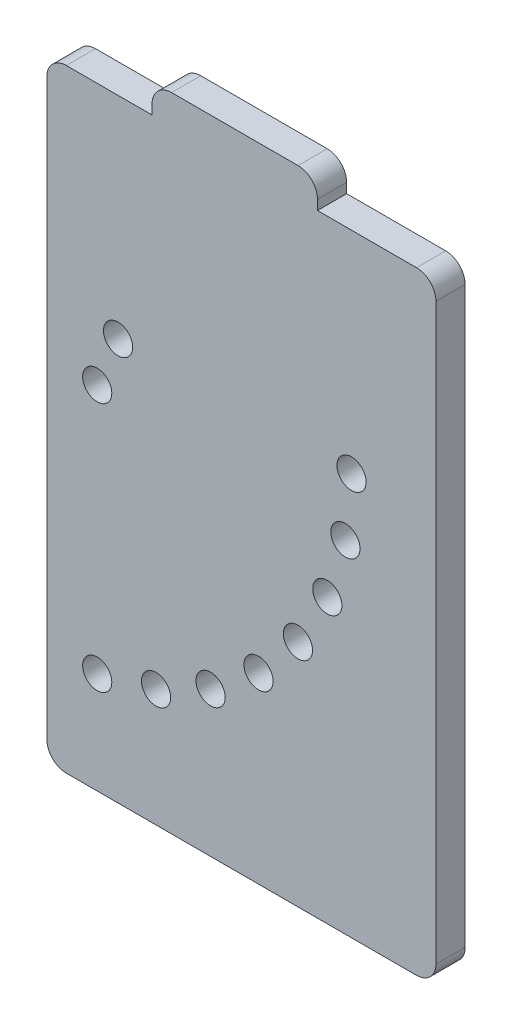
ISO-10303-21;
HEADER;
FILE_DESCRIPTION(('STEP AP214'),'2;1');
FILE_NAME('part.step','',(''),(''),'','','');
FILE_SCHEMA(('AUTOMOTIVE_DESIGN { 1 0 10303 214 1 1 1 1 }'));
ENDSEC;
DATA;
#1=APPLICATION_CONTEXT('core data for automotive mechanical design processes');
#2=APPLICATION_PROTOCOL_DEFINITION('international standard','automotive_design',2000,#1);
#3=PRODUCT_CONTEXT('',#1,'mechanical');
#4=PRODUCT('Part','Part','',(#3));
#5=PRODUCT_RELATED_PRODUCT_CATEGORY('part','',(#4));
#6=PRODUCT_DEFINITION_FORMATION('','',#4);
#7=PRODUCT_DEFINITION_CONTEXT('part definition',#1,'design');
#8=PRODUCT_DEFINITION('design','',#6,#7);
#9=PRODUCT_DEFINITION_SHAPE('','',#8);
#10=(LENGTH_UNIT() NAMED_UNIT(*) SI_UNIT(.MILLI.,.METRE.));
#11=(NAMED_UNIT(*) PLANE_ANGLE_UNIT() SI_UNIT($,.RADIAN.));
#12=(NAMED_UNIT(*) SI_UNIT($,.STERADIAN.) SOLID_ANGLE_UNIT());
#13=UNCERTAINTY_MEASURE_WITH_UNIT(LENGTH_MEASURE(1.E-05),#10,'distance_accuracy_value','');
#14=(GEOMETRIC_REPRESENTATION_CONTEXT(3) GLOBAL_UNCERTAINTY_ASSIGNED_CONTEXT((#13)) GLOBAL_UNIT_ASSIGNED_CONTEXT((#10,
#11,#12)) REPRESENTATION_CONTEXT('',''));
#15=CARTESIAN_POINT('',(0.,0.,0.));
#16=DIRECTION('',(0.,0.,1.));
#17=DIRECTION('',(1.,0.,0.));
#18=AXIS2_PLACEMENT_3D('',#15,#16,#17);
#19=CARTESIAN_POINT('',(0.,63.,3.));
#20=DIRECTION('',(0.,1.,0.));
#21=DIRECTION('',(0.,0.,1.));
#22=AXIS2_PLACEMENT_3D('',#19,#20,#21);
#23=PLANE('',#22);
#24=DIRECTION('',(1.,0.,0.));
#25=VECTOR('',#24,1.);
#26=CARTESIAN_POINT('',(0.,63.,0.));
#27=LINE('',#26,#25);
#28=CARTESIAN_POINT('',(2.00000000000002,63.,0.));
#29=VERTEX_POINT('',#28);
#30=CARTESIAN_POINT('',(10.82,63.,0.));
#31=VERTEX_POINT('',#30);
#32=EDGE_CURVE('E258',#29,#31,#27,.T.);
#33=ORIENTED_EDGE('',*,*,#32,.F.);
#34=DIRECTION('',(0.,0.,-1.));
#35=VECTOR('',#34,1.);
#36=CARTESIAN_POINT('',(2.00000000000002,63.,3.));
#37=LINE('',#36,#35);
#38=CARTESIAN_POINT('',(2.00000000000002,63.,3.));
#39=VERTEX_POINT('',#38);
#40=EDGE_CURVE('E210',#29,#39,#37,.F.);
#41=ORIENTED_EDGE('',*,*,#40,.T.);
#42=DIRECTION('',(1.,0.,0.));
#43=VECTOR('',#42,1.);
#44=CARTESIAN_POINT('',(0.,63.,3.));
#45=LINE('',#44,#43);
#46=CARTESIAN_POINT('',(10.82,63.,3.));
#47=VERTEX_POINT('',#46);
#48=EDGE_CURVE('E175',#39,#47,#45,.T.);
#49=ORIENTED_EDGE('',*,*,#48,.T.);
#50=DIRECTION('',(0.,0.,-1.));
#51=VECTOR('',#50,1.);
#52=CARTESIAN_POINT('',(10.82,63.,3.));
#53=LINE('',#52,#51);
#54=EDGE_CURVE('E161',#47,#31,#53,.T.);
#55=ORIENTED_EDGE('',*,*,#54,.T.);
#56=EDGE_LOOP('',(#33,#41,#49,#55));
#57=FACE_BOUND('',#56,.T.);
#58=ADVANCED_FACE('F43',(#57),#23,.T.);
#59=CARTESIAN_POINT('',(0.,0.,3.));
#60=DIRECTION('',(1.,0.,0.));
#61=DIRECTION('',(0.,1.,0.));
#62=AXIS2_PLACEMENT_3D('',#59,#60,#61);
#63=PLANE('',#62);
#64=DIRECTION('',(0.,-1.,0.));
#65=VECTOR('',#64,1.);
#66=CARTESIAN_POINT('',(0.,0.,3.));
#67=LINE('',#66,#65);
#68=CARTESIAN_POINT('',(0.,61.,3.));
#69=VERTEX_POINT('',#68);
#70=CARTESIAN_POINT('',(0.,2.,3.));
#71=VERTEX_POINT('',#70);
#72=EDGE_CURVE('E176',#69,#71,#67,.T.);
#73=ORIENTED_EDGE('',*,*,#72,.F.);
#74=DIRECTION('',(0.,0.,-1.));
#75=VECTOR('',#74,1.);
#76=CARTESIAN_POINT('',(0.,61.,0.));
#77=LINE('',#76,#75);
#78=CARTESIAN_POINT('',(0.,61.,0.));
#79=VERTEX_POINT('',#78);
#80=EDGE_CURVE('E198',#69,#79,#77,.T.);
#81=ORIENTED_EDGE('',*,*,#80,.T.);
#82=DIRECTION('',(0.,-1.,0.));
#83=VECTOR('',#82,1.);
#84=CARTESIAN_POINT('',(0.,0.,0.));
#85=LINE('',#84,#83);
#86=CARTESIAN_POINT('',(0.,2.,0.));
#87=VERTEX_POINT('',#86);
#88=EDGE_CURVE('E365',#79,#87,#85,.T.);
#89=ORIENTED_EDGE('',*,*,#88,.T.);
#90=DIRECTION('',(0.,0.,-1.));
#91=VECTOR('',#90,1.);
#92=CARTESIAN_POINT('',(0.,2.,3.));
#93=LINE('',#92,#91);
#94=EDGE_CURVE('E162',#87,#71,#93,.F.);
#95=ORIENTED_EDGE('',*,*,#94,.T.);
#96=EDGE_LOOP('',(#73,#81,#89,#95));
#97=FACE_BOUND('',#96,.T.);
#98=ADVANCED_FACE('F310',(#97),#63,.F.);
#99=CARTESIAN_POINT('',(0.,0.,3.));
#100=DIRECTION('',(0.,1.,0.));
#101=DIRECTION('',(0.,0.,1.));
#102=AXIS2_PLACEMENT_3D('',#99,#100,#101);
#103=PLANE('',#102);
#104=DIRECTION('',(1.,0.,0.));
#105=VECTOR('',#104,1.);
#106=CARTESIAN_POINT('',(0.,0.,3.));
#107=LINE('',#106,#105);
#108=CARTESIAN_POINT('',(2.,0.,3.));
#109=VERTEX_POINT('',#108);
#110=CARTESIAN_POINT('',(38.,0.,3.));
#111=VERTEX_POINT('',#110);
#112=EDGE_CURVE('E173',#109,#111,#107,.T.);
#113=ORIENTED_EDGE('',*,*,#112,.F.);
#114=DIRECTION('',(0.,0.,-1.));
#115=VECTOR('',#114,1.);
#116=CARTESIAN_POINT('',(2.,0.,3.));
#117=LINE('',#116,#115);
#118=CARTESIAN_POINT('',(2.,0.,0.));
#119=VERTEX_POINT('',#118);
#120=EDGE_CURVE('E223',#109,#119,#117,.T.);
#121=ORIENTED_EDGE('',*,*,#120,.T.);
#122=DIRECTION('',(1.,0.,0.));
#123=VECTOR('',#122,1.);
#124=CARTESIAN_POINT('',(0.,0.,0.));
#125=LINE('',#124,#123);
#126=CARTESIAN_POINT('',(38.,0.,0.));
#127=VERTEX_POINT('',#126);
#128=EDGE_CURVE('E392',#119,#127,#125,.T.);
#129=ORIENTED_EDGE('',*,*,#128,.T.);
#130=DIRECTION('',(0.,0.,-1.));
#131=VECTOR('',#130,1.);
#132=CARTESIAN_POINT('',(38.,0.,3.));
#133=LINE('',#132,#131);
#134=EDGE_CURVE('E224',#127,#111,#133,.F.);
#135=ORIENTED_EDGE('',*,*,#134,.T.);
#136=EDGE_LOOP('',(#113,#121,#129,#135));
#137=FACE_BOUND('',#136,.T.);
#138=ADVANCED_FACE('F312',(#137),#103,.F.);
#139=CARTESIAN_POINT('',(40.,0.,3.));
#140=DIRECTION('',(-1.,0.,0.));
#141=DIRECTION('',(0.,0.,1.));
#142=AXIS2_PLACEMENT_3D('',#139,#140,#141);
#143=PLANE('',#142);
#144=DIRECTION('',(0.,1.,0.));
#145=VECTOR('',#144,1.);
#146=CARTESIAN_POINT('',(40.,0.,0.));
#147=LINE('',#146,#145);
#148=CARTESIAN_POINT('',(40.,2.,0.));
#149=VERTEX_POINT('',#148);
#150=CARTESIAN_POINT('',(40.,61.,0.));
#151=VERTEX_POINT('',#150);
#152=EDGE_CURVE('E256',#149,#151,#147,.T.);
#153=ORIENTED_EDGE('',*,*,#152,.T.);
#154=DIRECTION('',(0.,0.,-1.));
#155=VECTOR('',#154,1.);
#156=CARTESIAN_POINT('',(40.,61.,3.));
#157=LINE('',#156,#155);
#158=CARTESIAN_POINT('',(40.,61.,3.));
#159=VERTEX_POINT('',#158);
#160=EDGE_CURVE('E222',#151,#159,#157,.F.);
#161=ORIENTED_EDGE('',*,*,#160,.T.);
#162=DIRECTION('',(0.,1.,0.));
#163=VECTOR('',#162,1.);
#164=CARTESIAN_POINT('',(40.,0.,3.));
#165=LINE('',#164,#163);
#166=CARTESIAN_POINT('',(40.,2.,3.));
#167=VERTEX_POINT('',#166);
#168=EDGE_CURVE('E167',#167,#159,#165,.T.);
#169=ORIENTED_EDGE('',*,*,#168,.F.);
#170=DIRECTION('',(0.,0.,-1.));
#171=VECTOR('',#170,1.);
#172=CARTESIAN_POINT('',(40.,2.,3.));
#173=LINE('',#172,#171);
#174=EDGE_CURVE('E216',#167,#149,#173,.T.);
#175=ORIENTED_EDGE('',*,*,#174,.T.);
#176=EDGE_LOOP('',(#153,#161,#169,#175));
#177=FACE_BOUND('',#176,.T.);
#178=ADVANCED_FACE('F318',(#177),#143,.F.);
#179=CARTESIAN_POINT('',(27.82,63.,3.));
#180=VERTEX_POINT('',#179);
#181=CARTESIAN_POINT('',(38.,63.,3.));
#182=VERTEX_POINT('',#181);
#183=EDGE_CURVE('E151',#180,#182,#45,.T.);
#184=ORIENTED_EDGE('',*,*,#183,.T.);
#185=DIRECTION('',(0.,0.,-1.));
#186=VECTOR('',#185,1.);
#187=CARTESIAN_POINT('',(38.,63.,0.));
#188=LINE('',#187,#186);
#189=CARTESIAN_POINT('',(38.,63.,0.));
#190=VERTEX_POINT('',#189);
#191=EDGE_CURVE('E218',#182,#190,#188,.T.);
#192=ORIENTED_EDGE('',*,*,#191,.T.);
#193=CARTESIAN_POINT('',(27.82,63.,0.));
#194=VERTEX_POINT('',#193);
#195=EDGE_CURVE('E163',#194,#190,#27,.T.);
#196=ORIENTED_EDGE('',*,*,#195,.F.);
#197=DIRECTION('',(0.,0.,-1.));
#198=VECTOR('',#197,1.);
#199=CARTESIAN_POINT('',(27.82,63.,3.));
#200=LINE('',#199,#198);
#201=EDGE_CURVE('E150',#180,#194,#200,.T.);
#202=ORIENTED_EDGE('',*,*,#201,.F.);
#203=EDGE_LOOP('',(#184,#192,#196,#202));
#204=FACE_BOUND('',#203,.T.);
#205=ADVANCED_FACE('F160',(#204),#23,.T.);
#206=CARTESIAN_POINT('',(27.82,0.,3.));
#207=DIRECTION('',(1.,0.,0.));
#208=DIRECTION('',(0.,0.,-1.));
#209=AXIS2_PLACEMENT_3D('',#206,#207,#208);
#210=PLANE('',#209);
#211=DIRECTION('',(0.,-1.,0.));
#212=VECTOR('',#211,1.);
#213=CARTESIAN_POINT('',(27.82,0.,0.));
#214=LINE('',#213,#212);
#215=CARTESIAN_POINT('',(27.82,64.,0.));
#216=VERTEX_POINT('',#215);
#217=EDGE_CURVE('E255',#216,#194,#214,.T.);
#218=ORIENTED_EDGE('',*,*,#217,.F.);
#219=DIRECTION('',(0.,0.,-1.));
#220=VECTOR('',#219,1.);
#221=CARTESIAN_POINT('',(27.82,64.,3.));
#222=LINE('',#221,#220);
#223=CARTESIAN_POINT('',(27.82,64.,3.));
#224=VERTEX_POINT('',#223);
#225=EDGE_CURVE('E68',#216,#224,#222,.F.);
#226=ORIENTED_EDGE('',*,*,#225,.T.);
#227=DIRECTION('',(0.,-1.,0.));
#228=VECTOR('',#227,1.);
#229=CARTESIAN_POINT('',(27.82,0.,3.));
#230=LINE('',#229,#228);
#231=EDGE_CURVE('E143',#224,#180,#230,.T.);
#232=ORIENTED_EDGE('',*,*,#231,.T.);
#233=ORIENTED_EDGE('',*,*,#201,.T.);
#234=EDGE_LOOP('',(#218,#226,#232,#233));
#235=FACE_BOUND('',#234,.T.);
#236=ADVANCED_FACE('F146',(#235),#210,.T.);
#237=CARTESIAN_POINT('',(0.,66.,3.));
#238=DIRECTION('',(0.,1.,0.));
#239=DIRECTION('',(0.,0.,1.));
#240=AXIS2_PLACEMENT_3D('',#237,#238,#239);
#241=PLANE('',#240);
#242=DIRECTION('',(1.,0.,0.));
#243=VECTOR('',#242,1.);
#244=CARTESIAN_POINT('',(0.,66.,3.));
#245=LINE('',#244,#243);
#246=CARTESIAN_POINT('',(12.82,66.,3.));
#247=VERTEX_POINT('',#246);
#248=CARTESIAN_POINT('',(25.82,66.,3.));
#249=VERTEX_POINT('',#248);
#250=EDGE_CURVE('E155',#247,#249,#245,.T.);
#251=ORIENTED_EDGE('',*,*,#250,.T.);
#252=DIRECTION('',(0.,0.,-1.));
#253=VECTOR('',#252,1.);
#254=CARTESIAN_POINT('',(25.82,66.,3.));
#255=LINE('',#254,#253);
#256=CARTESIAN_POINT('',(25.82,66.,0.));
#257=VERTEX_POINT('',#256);
#258=EDGE_CURVE('E229',#249,#257,#255,.T.);
#259=ORIENTED_EDGE('',*,*,#258,.T.);
#260=DIRECTION('',(1.,0.,0.));
#261=VECTOR('',#260,1.);
#262=CARTESIAN_POINT('',(0.,66.,0.));
#263=LINE('',#262,#261);
#264=CARTESIAN_POINT('',(12.82,66.,0.));
#265=VERTEX_POINT('',#264);
#266=EDGE_CURVE('E254',#265,#257,#263,.T.);
#267=ORIENTED_EDGE('',*,*,#266,.F.);
#268=DIRECTION('',(0.,0.,-1.));
#269=VECTOR('',#268,1.);
#270=CARTESIAN_POINT('',(12.82,66.,3.));
#271=LINE('',#270,#269);
#272=EDGE_CURVE('E226',#265,#247,#271,.F.);
#273=ORIENTED_EDGE('',*,*,#272,.T.);
#274=EDGE_LOOP('',(#251,#259,#267,#273));
#275=FACE_BOUND('',#274,.T.);
#276=ADVANCED_FACE('F245',(#275),#241,.T.);
#277=CARTESIAN_POINT('',(7.31999999999999,41.32,3.));
#278=DIRECTION('',(0.,0.,-1.));
#279=DIRECTION('',(-1.,0.,0.));
#280=AXIS2_PLACEMENT_3D('',#277,#278,#279);
#281=CYLINDRICAL_SURFACE('',#280,1.5);
#282=CARTESIAN_POINT('',(7.31999999999999,41.32,3.));
#283=DIRECTION('',(0.,0.,1.));
#284=DIRECTION('',(1.,0.,0.));
#285=AXIS2_PLACEMENT_3D('',#282,#283,#284);
#286=CIRCLE('',#285,1.5);
#287=CARTESIAN_POINT('',(8.81999999999999,41.32,3.));
#288=VERTEX_POINT('',#287);
#289=EDGE_CURVE('E388',#288,#288,#286,.T.);
#290=ORIENTED_EDGE('',*,*,#289,.T.);
#291=EDGE_LOOP('',(#290));
#292=FACE_BOUND('',#291,.T.);
#293=CARTESIAN_POINT('',(7.31999999999999,41.32,0.));
#294=DIRECTION('',(0.,0.,1.));
#295=DIRECTION('',(1.,0.,0.));
#296=AXIS2_PLACEMENT_3D('',#293,#294,#295);
#297=CIRCLE('',#296,1.5);
#298=CARTESIAN_POINT('',(8.81999999999999,41.32,0.));
#299=VERTEX_POINT('',#298);
#300=EDGE_CURVE('E183',#299,#299,#297,.T.);
#301=ORIENTED_EDGE('',*,*,#300,.F.);
#302=EDGE_LOOP('',(#301));
#303=FACE_BOUND('',#302,.T.);
#304=ADVANCED_FACE('F291',(#292,#303),#281,.F.);
#305=CARTESIAN_POINT('',(31.32,41.32,3.));
#306=DIRECTION('',(0.,0.,-1.));
#307=DIRECTION('',(-1.,0.,0.));
#308=AXIS2_PLACEMENT_3D('',#305,#306,#307);
#309=CYLINDRICAL_SURFACE('',#308,1.5);
#310=CARTESIAN_POINT('',(31.32,41.32,3.));
#311=DIRECTION('',(0.,0.,1.));
#312=DIRECTION('',(1.,0.,0.));
#313=AXIS2_PLACEMENT_3D('',#310,#311,#312);
#314=CIRCLE('',#313,1.5);
#315=CARTESIAN_POINT('',(32.82,41.32,3.));
#316=VERTEX_POINT('',#315);
#317=EDGE_CURVE('E386',#316,#316,#314,.T.);
#318=ORIENTED_EDGE('',*,*,#317,.T.);
#319=EDGE_LOOP('',(#318));
#320=FACE_BOUND('',#319,.T.);
#321=CARTESIAN_POINT('',(31.32,41.32,0.));
#322=DIRECTION('',(0.,0.,1.));
#323=DIRECTION('',(1.,0.,0.));
#324=AXIS2_PLACEMENT_3D('',#321,#322,#323);
#325=CIRCLE('',#324,1.5);
#326=CARTESIAN_POINT('',(32.82,41.32,0.));
#327=VERTEX_POINT('',#326);
#328=EDGE_CURVE('E186',#327,#327,#325,.T.);
#329=ORIENTED_EDGE('',*,*,#328,.F.);
#330=EDGE_LOOP('',(#329));
#331=FACE_BOUND('',#330,.T.);
#332=ADVANCED_FACE('F288',(#320,#331),#309,.F.);
#333=CARTESIAN_POINT('',(30.6914360987138,35.0767516308763,3.));
#334=DIRECTION('',(0.,0.,-1.));
#335=DIRECTION('',(-1.,0.,0.));
#336=AXIS2_PLACEMENT_3D('',#333,#334,#335);
#337=CYLINDRICAL_SURFACE('',#336,1.50000000000001);
#338=CARTESIAN_POINT('',(30.6914360987138,35.0767516308763,3.));
#339=DIRECTION('',(0.,0.,1.));
#340=DIRECTION('',(1.,0.,0.));
#341=AXIS2_PLACEMENT_3D('',#338,#339,#340);
#342=CIRCLE('',#341,1.50000000000001);
#343=CARTESIAN_POINT('',(32.1914360987138,35.0767516308763,3.));
#344=VERTEX_POINT('',#343);
#345=EDGE_CURVE('E381',#344,#344,#342,.T.);
#346=ORIENTED_EDGE('',*,*,#345,.T.);
#347=EDGE_LOOP('',(#346));
#348=FACE_BOUND('',#347,.T.);
#349=CARTESIAN_POINT('',(30.6914360987138,35.0767516308763,0.));
#350=DIRECTION('',(0.,0.,1.));
#351=DIRECTION('',(1.,0.,0.));
#352=AXIS2_PLACEMENT_3D('',#349,#350,#351);
#353=CIRCLE('',#352,1.50000000000001);
#354=CARTESIAN_POINT('',(32.1914360987138,35.0767516308763,0.));
#355=VERTEX_POINT('',#354);
#356=EDGE_CURVE('E281',#355,#355,#353,.T.);
#357=ORIENTED_EDGE('',*,*,#356,.F.);
#358=EDGE_LOOP('',(#357));
#359=FACE_BOUND('',#358,.T.);
#360=ADVANCED_FACE('F292',(#348,#359),#337,.F.);
#361=CARTESIAN_POINT('',(28.8309738059665,29.0840958895684,3.));
#362=DIRECTION('',(0.,0.,-1.));
#363=DIRECTION('',(-1.,0.,0.));
#364=AXIS2_PLACEMENT_3D('',#361,#362,#363);
#365=CYLINDRICAL_SURFACE('',#364,1.5);
#366=CARTESIAN_POINT('',(28.8309738059665,29.0840958895684,3.));
#367=DIRECTION('',(0.,0.,1.));
#368=DIRECTION('',(1.,0.,0.));
#369=AXIS2_PLACEMENT_3D('',#366,#367,#368);
#370=CIRCLE('',#369,1.5);
#371=CARTESIAN_POINT('',(30.3309738059665,29.0840958895684,3.));
#372=VERTEX_POINT('',#371);
#373=EDGE_CURVE('E382',#372,#372,#370,.T.);
#374=ORIENTED_EDGE('',*,*,#373,.T.);
#375=EDGE_LOOP('',(#374));
#376=FACE_BOUND('',#375,.T.);
#377=CARTESIAN_POINT('',(28.8309738059665,29.0840958895684,0.));
#378=DIRECTION('',(0.,0.,1.));
#379=DIRECTION('',(1.,0.,0.));
#380=AXIS2_PLACEMENT_3D('',#377,#378,#379);
#381=CIRCLE('',#380,1.5);
#382=CARTESIAN_POINT('',(30.3309738059665,29.0840958895684,0.));
#383=VERTEX_POINT('',#382);
#384=EDGE_CURVE('E277',#383,#383,#381,.T.);
#385=ORIENTED_EDGE('',*,*,#384,.F.);
#386=EDGE_LOOP('',(#385));
#387=FACE_BOUND('',#386,.T.);
#388=ADVANCED_FACE('F297',(#376,#387),#365,.F.);
#389=CARTESIAN_POINT('',(25.8132886924428,23.5825670718504,3.));
#390=DIRECTION('',(0.,0.,-1.));
#391=DIRECTION('',(-1.,0.,0.));
#392=AXIS2_PLACEMENT_3D('',#389,#390,#391);
#393=CYLINDRICAL_SURFACE('',#392,1.5);
#394=CARTESIAN_POINT('',(25.8132886924428,23.5825670718504,3.));
#395=DIRECTION('',(0.,0.,1.));
#396=DIRECTION('',(1.,0.,0.));
#397=AXIS2_PLACEMENT_3D('',#394,#395,#396);
#398=CIRCLE('',#397,1.5);
#399=CARTESIAN_POINT('',(27.3132886924428,23.5825670718504,3.));
#400=VERTEX_POINT('',#399);
#401=EDGE_CURVE('E377',#400,#400,#398,.T.);
#402=ORIENTED_EDGE('',*,*,#401,.T.);
#403=EDGE_LOOP('',(#402));
#404=FACE_BOUND('',#403,.T.);
#405=CARTESIAN_POINT('',(25.8132886924428,23.5825670718504,0.));
#406=DIRECTION('',(0.,0.,1.));
#407=DIRECTION('',(1.,0.,0.));
#408=AXIS2_PLACEMENT_3D('',#405,#406,#407);
#409=CIRCLE('',#408,1.5);
#410=CARTESIAN_POINT('',(27.3132886924428,23.5825670718504,0.));
#411=VERTEX_POINT('',#410);
#412=EDGE_CURVE('E276',#411,#411,#409,.T.);
#413=ORIENTED_EDGE('',*,*,#412,.F.);
#414=EDGE_LOOP('',(#413));
#415=FACE_BOUND('',#414,.T.);
#416=ADVANCED_FACE('F539',(#404,#415),#393,.F.);
#417=CARTESIAN_POINT('',(21.7595051468917,18.7929865325562,3.));
#418=DIRECTION('',(0.,0.,-1.));
#419=DIRECTION('',(-1.,0.,0.));
#420=AXIS2_PLACEMENT_3D('',#417,#418,#419);
#421=CYLINDRICAL_SURFACE('',#420,1.50000000000001);
#422=CARTESIAN_POINT('',(21.7595051468917,18.7929865325562,3.));
#423=DIRECTION('',(0.,0.,1.));
#424=DIRECTION('',(1.,0.,0.));
#425=AXIS2_PLACEMENT_3D('',#422,#423,#424);
#426=CIRCLE('',#425,1.50000000000001);
#427=CARTESIAN_POINT('',(23.2595051468917,18.7929865325562,3.));
#428=VERTEX_POINT('',#427);
#429=EDGE_CURVE('E374',#428,#428,#426,.T.);
#430=ORIENTED_EDGE('',*,*,#429,.T.);
#431=EDGE_LOOP('',(#430));
#432=FACE_BOUND('',#431,.T.);
#433=CARTESIAN_POINT('',(21.7595051468917,18.7929865325562,0.));
#434=DIRECTION('',(0.,0.,1.));
#435=DIRECTION('',(1.,0.,0.));
#436=AXIS2_PLACEMENT_3D('',#433,#434,#435);
#437=CIRCLE('',#436,1.50000000000001);
#438=CARTESIAN_POINT('',(23.2595051468917,18.7929865325562,0.));
#439=VERTEX_POINT('',#438);
#440=EDGE_CURVE('E274',#439,#439,#437,.T.);
#441=ORIENTED_EDGE('',*,*,#440,.F.);
#442=EDGE_LOOP('',(#441));
#443=FACE_BOUND('',#442,.T.);
#444=ADVANCED_FACE('F527',(#432,#443),#421,.F.);
#445=CARTESIAN_POINT('',(16.8323346635893,14.9075993182572,3.));
#446=DIRECTION('',(0.,0.,-1.));
#447=DIRECTION('',(-1.,0.,0.));
#448=AXIS2_PLACEMENT_3D('',#445,#446,#447);
#449=CYLINDRICAL_SURFACE('',#448,1.50000000000001);
#450=CARTESIAN_POINT('',(16.8323346635893,14.9075993182572,3.));
#451=DIRECTION('',(0.,0.,1.));
#452=DIRECTION('',(1.,0.,0.));
#453=AXIS2_PLACEMENT_3D('',#450,#451,#452);
#454=CIRCLE('',#453,1.50000000000001);
#455=CARTESIAN_POINT('',(18.3323346635893,14.9075993182572,3.));
#456=VERTEX_POINT('',#455);
#457=EDGE_CURVE('E375',#456,#456,#454,.T.);
#458=ORIENTED_EDGE('',*,*,#457,.T.);
#459=EDGE_LOOP('',(#458));
#460=FACE_BOUND('',#459,.T.);
#461=CARTESIAN_POINT('',(16.8323346635893,14.9075993182572,0.));
#462=DIRECTION('',(0.,0.,1.));
#463=DIRECTION('',(1.,0.,0.));
#464=AXIS2_PLACEMENT_3D('',#461,#462,#463);
#465=CIRCLE('',#464,1.50000000000001);
#466=CARTESIAN_POINT('',(18.3323346635893,14.9075993182572,0.));
#467=VERTEX_POINT('',#466);
#468=EDGE_CURVE('E272',#467,#467,#465,.T.);
#469=ORIENTED_EDGE('',*,*,#468,.F.);
#470=EDGE_LOOP('',(#469));
#471=FACE_BOUND('',#470,.T.);
#472=ADVANCED_FACE('F516',(#460,#471),#449,.F.);
#473=CARTESIAN_POINT('',(11.2295448990672,12.0823578009472,3.));
#474=DIRECTION('',(0.,0.,-1.));
#475=DIRECTION('',(-1.,0.,0.));
#476=AXIS2_PLACEMENT_3D('',#473,#474,#475);
#477=CYLINDRICAL_SURFACE('',#476,1.5);
#478=CARTESIAN_POINT('',(11.2295448990672,12.0823578009472,3.));
#479=DIRECTION('',(0.,0.,1.));
#480=DIRECTION('',(1.,0.,0.));
#481=AXIS2_PLACEMENT_3D('',#478,#479,#480);
#482=CIRCLE('',#481,1.5);
#483=CARTESIAN_POINT('',(12.7295448990672,12.0823578009472,3.));
#484=VERTEX_POINT('',#483);
#485=EDGE_CURVE('E370',#484,#484,#482,.T.);
#486=ORIENTED_EDGE('',*,*,#485,.T.);
#487=EDGE_LOOP('',(#486));
#488=FACE_BOUND('',#487,.T.);
#489=CARTESIAN_POINT('',(11.2295448990672,12.0823578009472,0.));
#490=DIRECTION('',(0.,0.,1.));
#491=DIRECTION('',(1.,0.,0.));
#492=AXIS2_PLACEMENT_3D('',#489,#490,#491);
#493=CIRCLE('',#492,1.5);
#494=CARTESIAN_POINT('',(12.7295448990672,12.0823578009472,0.));
#495=VERTEX_POINT('',#494);
#496=EDGE_CURVE('E269',#495,#495,#493,.T.);
#497=ORIENTED_EDGE('',*,*,#496,.F.);
#498=EDGE_LOOP('',(#497));
#499=FACE_BOUND('',#498,.T.);
#500=ADVANCED_FACE('F435',(#488,#499),#477,.F.);
#501=CARTESIAN_POINT('',(5.17602163828552,10.4306620336401,3.));
#502=DIRECTION('',(0.,0.,-1.));
#503=DIRECTION('',(-1.,0.,0.));
#504=AXIS2_PLACEMENT_3D('',#501,#502,#503);
#505=CYLINDRICAL_SURFACE('',#504,1.50000000000001);
#506=CARTESIAN_POINT('',(5.17602163828552,10.4306620336401,3.));
#507=DIRECTION('',(0.,0.,1.));
#508=DIRECTION('',(1.,0.,0.));
#509=AXIS2_PLACEMENT_3D('',#506,#507,#508);
#510=CIRCLE('',#509,1.50000000000001);
#511=CARTESIAN_POINT('',(6.67602163828552,10.4306620336401,3.));
#512=VERTEX_POINT('',#511);
#513=EDGE_CURVE('E364',#512,#512,#510,.T.);
#514=ORIENTED_EDGE('',*,*,#513,.T.);
#515=EDGE_LOOP('',(#514));
#516=FACE_BOUND('',#515,.T.);
#517=CARTESIAN_POINT('',(5.17602163828552,10.4306620336401,0.));
#518=DIRECTION('',(0.,0.,1.));
#519=DIRECTION('',(1.,0.,0.));
#520=AXIS2_PLACEMENT_3D('',#517,#518,#519);
#521=CIRCLE('',#520,1.50000000000001);
#522=CARTESIAN_POINT('',(6.67602163828552,10.4306620336401,0.));
#523=VERTEX_POINT('',#522);
#524=EDGE_CURVE('E262',#523,#523,#521,.T.);
#525=ORIENTED_EDGE('',*,*,#524,.F.);
#526=EDGE_LOOP('',(#525));
#527=FACE_BOUND('',#526,.T.);
#528=ADVANCED_FACE('F430',(#516,#527),#505,.F.);
#529=CARTESIAN_POINT('',(10.82,0.,3.));
#530=DIRECTION('',(-1.,0.,0.));
#531=DIRECTION('',(0.,0.,1.));
#532=AXIS2_PLACEMENT_3D('',#529,#530,#531);
#533=PLANE('',#532);
#534=DIRECTION('',(0.,1.,0.));
#535=VECTOR('',#534,1.);
#536=CARTESIAN_POINT('',(10.82,0.,3.));
#537=LINE('',#536,#535);
#538=CARTESIAN_POINT('',(10.82,64.,3.));
#539=VERTEX_POINT('',#538);
#540=EDGE_CURVE('E246',#47,#539,#537,.T.);
#541=ORIENTED_EDGE('',*,*,#540,.T.);
#542=DIRECTION('',(0.,0.,-1.));
#543=VECTOR('',#542,1.);
#544=CARTESIAN_POINT('',(10.82,64.,3.));
#545=LINE('',#544,#543);
#546=CARTESIAN_POINT('',(10.82,64.,0.));
#547=VERTEX_POINT('',#546);
#548=EDGE_CURVE('E11',#539,#547,#545,.T.);
#549=ORIENTED_EDGE('',*,*,#548,.T.);
#550=DIRECTION('',(0.,1.,0.));
#551=VECTOR('',#550,1.);
#552=CARTESIAN_POINT('',(10.82,0.,0.));
#553=LINE('',#552,#551);
#554=EDGE_CURVE('E253',#31,#547,#553,.T.);
#555=ORIENTED_EDGE('',*,*,#554,.F.);
#556=ORIENTED_EDGE('',*,*,#54,.F.);
#557=EDGE_LOOP('',(#541,#549,#555,#556));
#558=FACE_BOUND('',#557,.T.);
#559=ADVANCED_FACE('F360',(#558),#533,.T.);
#560=CARTESIAN_POINT('',(5.17602163828552,36.1439783617145,3.));
#561=DIRECTION('',(0.,0.,-1.));
#562=DIRECTION('',(-1.,0.,0.));
#563=AXIS2_PLACEMENT_3D('',#560,#561,#562);
#564=CYLINDRICAL_SURFACE('',#563,1.5);
#565=CARTESIAN_POINT('',(5.17602163828552,36.1439783617145,3.));
#566=DIRECTION('',(0.,0.,1.));
#567=DIRECTION('',(1.,0.,0.));
#568=AXIS2_PLACEMENT_3D('',#565,#566,#567);
#569=CIRCLE('',#568,1.5);
#570=CARTESIAN_POINT('',(6.67602163828552,36.1439783617145,3.));
#571=VERTEX_POINT('',#570);
#572=EDGE_CURVE('E195',#571,#571,#569,.T.);
#573=ORIENTED_EDGE('',*,*,#572,.T.);
#574=EDGE_LOOP('',(#573));
#575=FACE_BOUND('',#574,.T.);
#576=CARTESIAN_POINT('',(5.17602163828552,36.1439783617145,0.));
#577=DIRECTION('',(0.,0.,1.));
#578=DIRECTION('',(1.,0.,0.));
#579=AXIS2_PLACEMENT_3D('',#576,#577,#578);
#580=CIRCLE('',#579,1.5);
#581=CARTESIAN_POINT('',(6.67602163828552,36.1439783617145,0.));
#582=VERTEX_POINT('',#581);
#583=EDGE_CURVE('E180',#582,#582,#580,.T.);
#584=ORIENTED_EDGE('',*,*,#583,.F.);
#585=EDGE_LOOP('',(#584));
#586=FACE_BOUND('',#585,.T.);
#587=ADVANCED_FACE('F414',(#575,#586),#564,.F.);
#588=CARTESIAN_POINT('',(0.,0.,3.));
#589=DIRECTION('',(0.,0.,1.));
#590=DIRECTION('',(1.,0.,0.));
#591=AXIS2_PLACEMENT_3D('',#588,#589,#590);
#592=PLANE('',#591);
#593=ORIENTED_EDGE('',*,*,#231,.F.);
#594=CARTESIAN_POINT('',(25.82,64.,3.));
#595=DIRECTION('',(0.,0.,1.));
#596=DIRECTION('',(1.,0.,0.));
#597=AXIS2_PLACEMENT_3D('',#594,#595,#596);
#598=CIRCLE('',#597,2.);
#599=EDGE_CURVE('E51',#224,#249,#598,.T.);
#600=ORIENTED_EDGE('',*,*,#599,.T.);
#601=ORIENTED_EDGE('',*,*,#250,.F.);
#602=CARTESIAN_POINT('',(12.82,64.,3.));
#603=DIRECTION('',(0.,0.,1.));
#604=DIRECTION('',(1.,0.,0.));
#605=AXIS2_PLACEMENT_3D('',#602,#603,#604);
#606=CIRCLE('',#605,2.);
#607=EDGE_CURVE('E59',#247,#539,#606,.T.);
#608=ORIENTED_EDGE('',*,*,#607,.T.);
#609=ORIENTED_EDGE('',*,*,#540,.F.);
#610=ORIENTED_EDGE('',*,*,#48,.F.);
#611=CARTESIAN_POINT('',(2.00000000000002,61.,3.));
#612=DIRECTION('',(0.,0.,1.));
#613=DIRECTION('',(1.,0.,0.));
#614=AXIS2_PLACEMENT_3D('',#611,#612,#613);
#615=CIRCLE('',#614,2.);
#616=EDGE_CURVE('E213',#39,#69,#615,.T.);
#617=ORIENTED_EDGE('',*,*,#616,.T.);
#618=ORIENTED_EDGE('',*,*,#72,.T.);
#619=CARTESIAN_POINT('',(2.,2.,3.));
#620=DIRECTION('',(0.,0.,1.));
#621=DIRECTION('',(1.,0.,0.));
#622=AXIS2_PLACEMENT_3D('',#619,#620,#621);
#623=CIRCLE('',#622,2.);
#624=EDGE_CURVE('E214',#71,#109,#623,.T.);
#625=ORIENTED_EDGE('',*,*,#624,.T.);
#626=ORIENTED_EDGE('',*,*,#112,.T.);
#627=CARTESIAN_POINT('',(38.,2.,3.));
#628=DIRECTION('',(0.,0.,1.));
#629=DIRECTION('',(1.,0.,0.));
#630=AXIS2_PLACEMENT_3D('',#627,#628,#629);
#631=CIRCLE('',#630,2.);
#632=EDGE_CURVE('E209',#111,#167,#631,.T.);
#633=ORIENTED_EDGE('',*,*,#632,.T.);
#634=ORIENTED_EDGE('',*,*,#168,.T.);
#635=CARTESIAN_POINT('',(38.,61.,3.));
#636=DIRECTION('',(0.,0.,1.));
#637=DIRECTION('',(1.,0.,0.));
#638=AXIS2_PLACEMENT_3D('',#635,#636,#637);
#639=CIRCLE('',#638,2.);
#640=EDGE_CURVE('E169',#159,#182,#639,.T.);
#641=ORIENTED_EDGE('',*,*,#640,.T.);
#642=ORIENTED_EDGE('',*,*,#183,.F.);
#643=EDGE_LOOP('',(#593,#600,#601,#608,#609,#610,#617,#618,#625,#626,#633,#634,#641,#642));
#644=FACE_BOUND('',#643,.T.);
#645=ORIENTED_EDGE('',*,*,#513,.F.);
#646=EDGE_LOOP('',(#645));
#647=FACE_BOUND('',#646,.T.);
#648=ORIENTED_EDGE('',*,*,#485,.F.);
#649=EDGE_LOOP('',(#648));
#650=FACE_BOUND('',#649,.T.);
#651=ORIENTED_EDGE('',*,*,#457,.F.);
#652=EDGE_LOOP('',(#651));
#653=FACE_BOUND('',#652,.T.);
#654=ORIENTED_EDGE('',*,*,#429,.F.);
#655=EDGE_LOOP('',(#654));
#656=FACE_BOUND('',#655,.T.);
#657=ORIENTED_EDGE('',*,*,#401,.F.);
#658=EDGE_LOOP('',(#657));
#659=FACE_BOUND('',#658,.T.);
#660=ORIENTED_EDGE('',*,*,#373,.F.);
#661=EDGE_LOOP('',(#660));
#662=FACE_BOUND('',#661,.T.);
#663=ORIENTED_EDGE('',*,*,#345,.F.);
#664=EDGE_LOOP('',(#663));
#665=FACE_BOUND('',#664,.T.);
#666=ORIENTED_EDGE('',*,*,#317,.F.);
#667=EDGE_LOOP('',(#666));
#668=FACE_BOUND('',#667,.T.);
#669=ORIENTED_EDGE('',*,*,#289,.F.);
#670=EDGE_LOOP('',(#669));
#671=FACE_BOUND('',#670,.T.);
#672=ORIENTED_EDGE('',*,*,#572,.F.);
#673=EDGE_LOOP('',(#672));
#674=FACE_BOUND('',#673,.T.);
#675=ADVANCED_FACE('F164',(#644,#647,#650,#653,#656,#659,#662,#665,#668,#671,#674),#592,.T.);
#676=CARTESIAN_POINT('',(0.,0.,0.));
#677=DIRECTION('',(0.,0.,1.));
#678=DIRECTION('',(1.,0.,0.));
#679=AXIS2_PLACEMENT_3D('',#676,#677,#678);
#680=PLANE('',#679);
#681=ORIENTED_EDGE('',*,*,#266,.T.);
#682=CARTESIAN_POINT('',(25.82,64.,0.));
#683=DIRECTION('',(0.,0.,1.));
#684=DIRECTION('',(1.,0.,0.));
#685=AXIS2_PLACEMENT_3D('',#682,#683,#684);
#686=CIRCLE('',#685,2.);
#687=EDGE_CURVE('E232',#257,#216,#686,.F.);
#688=ORIENTED_EDGE('',*,*,#687,.T.);
#689=ORIENTED_EDGE('',*,*,#217,.T.);
#690=ORIENTED_EDGE('',*,*,#195,.T.);
#691=CARTESIAN_POINT('',(38.,61.,0.));
#692=DIRECTION('',(0.,0.,1.));
#693=DIRECTION('',(1.,0.,0.));
#694=AXIS2_PLACEMENT_3D('',#691,#692,#693);
#695=CIRCLE('',#694,2.);
#696=EDGE_CURVE('E204',#190,#151,#695,.F.);
#697=ORIENTED_EDGE('',*,*,#696,.T.);
#698=ORIENTED_EDGE('',*,*,#152,.F.);
#699=CARTESIAN_POINT('',(38.,2.,0.));
#700=DIRECTION('',(0.,0.,1.));
#701=DIRECTION('',(1.,0.,0.));
#702=AXIS2_PLACEMENT_3D('',#699,#700,#701);
#703=CIRCLE('',#702,2.);
#704=EDGE_CURVE('E199',#149,#127,#703,.F.);
#705=ORIENTED_EDGE('',*,*,#704,.T.);
#706=ORIENTED_EDGE('',*,*,#128,.F.);
#707=CARTESIAN_POINT('',(2.,2.,0.));
#708=DIRECTION('',(0.,0.,1.));
#709=DIRECTION('',(1.,0.,0.));
#710=AXIS2_PLACEMENT_3D('',#707,#708,#709);
#711=CIRCLE('',#710,2.);
#712=EDGE_CURVE('E202',#119,#87,#711,.F.);
#713=ORIENTED_EDGE('',*,*,#712,.T.);
#714=ORIENTED_EDGE('',*,*,#88,.F.);
#715=CARTESIAN_POINT('',(2.00000000000002,61.,0.));
#716=DIRECTION('',(0.,0.,1.));
#717=DIRECTION('',(1.,0.,0.));
#718=AXIS2_PLACEMENT_3D('',#715,#716,#717);
#719=CIRCLE('',#718,2.);
#720=EDGE_CURVE('E203',#79,#29,#719,.F.);
#721=ORIENTED_EDGE('',*,*,#720,.T.);
#722=ORIENTED_EDGE('',*,*,#32,.T.);
#723=ORIENTED_EDGE('',*,*,#554,.T.);
#724=CARTESIAN_POINT('',(12.82,64.,0.));
#725=DIRECTION('',(0.,0.,1.));
#726=DIRECTION('',(1.,0.,0.));
#727=AXIS2_PLACEMENT_3D('',#724,#725,#726);
#728=CIRCLE('',#727,2.);
#729=EDGE_CURVE('E231',#547,#265,#728,.F.);
#730=ORIENTED_EDGE('',*,*,#729,.T.);
#731=EDGE_LOOP('',(#681,#688,#689,#690,#697,#698,#705,#706,#713,#714,#721,#722,#723,#730));
#732=FACE_BOUND('',#731,.T.);
#733=ORIENTED_EDGE('',*,*,#524,.T.);
#734=EDGE_LOOP('',(#733));
#735=FACE_BOUND('',#734,.T.);
#736=ORIENTED_EDGE('',*,*,#496,.T.);
#737=EDGE_LOOP('',(#736));
#738=FACE_BOUND('',#737,.T.);
#739=ORIENTED_EDGE('',*,*,#468,.T.);
#740=EDGE_LOOP('',(#739));
#741=FACE_BOUND('',#740,.T.);
#742=ORIENTED_EDGE('',*,*,#440,.T.);
#743=EDGE_LOOP('',(#742));
#744=FACE_BOUND('',#743,.T.);
#745=ORIENTED_EDGE('',*,*,#412,.T.);
#746=EDGE_LOOP('',(#745));
#747=FACE_BOUND('',#746,.T.);
#748=ORIENTED_EDGE('',*,*,#384,.T.);
#749=EDGE_LOOP('',(#748));
#750=FACE_BOUND('',#749,.T.);
#751=ORIENTED_EDGE('',*,*,#356,.T.);
#752=EDGE_LOOP('',(#751));
#753=FACE_BOUND('',#752,.T.);
#754=ORIENTED_EDGE('',*,*,#328,.T.);
#755=EDGE_LOOP('',(#754));
#756=FACE_BOUND('',#755,.T.);
#757=ORIENTED_EDGE('',*,*,#300,.T.);
#758=EDGE_LOOP('',(#757));
#759=FACE_BOUND('',#758,.T.);
#760=ORIENTED_EDGE('',*,*,#583,.T.);
#761=EDGE_LOOP('',(#760));
#762=FACE_BOUND('',#761,.T.);
#763=ADVANCED_FACE('F249',(#732,#735,#738,#741,#744,#747,#750,#753,#756,#759,#762),#680,.F.);
#764=CARTESIAN_POINT('',(2.00000000000002,61.,3.));
#765=DIRECTION('',(0.,0.,1.));
#766=DIRECTION('',(1.,0.,0.));
#767=AXIS2_PLACEMENT_3D('',#764,#765,#766);
#768=CYLINDRICAL_SURFACE('',#767,2.);
#769=ORIENTED_EDGE('',*,*,#616,.F.);
#770=ORIENTED_EDGE('',*,*,#40,.F.);
#771=ORIENTED_EDGE('',*,*,#720,.F.);
#772=ORIENTED_EDGE('',*,*,#80,.F.);
#773=EDGE_LOOP('',(#769,#770,#771,#772));
#774=FACE_BOUND('',#773,.T.);
#775=ADVANCED_FACE('F331',(#774),#768,.T.);
#776=CARTESIAN_POINT('',(38.,61.,3.));
#777=DIRECTION('',(0.,0.,1.));
#778=DIRECTION('',(1.,0.,0.));
#779=AXIS2_PLACEMENT_3D('',#776,#777,#778);
#780=CYLINDRICAL_SURFACE('',#779,2.);
#781=ORIENTED_EDGE('',*,*,#640,.F.);
#782=ORIENTED_EDGE('',*,*,#160,.F.);
#783=ORIENTED_EDGE('',*,*,#696,.F.);
#784=ORIENTED_EDGE('',*,*,#191,.F.);
#785=EDGE_LOOP('',(#781,#782,#783,#784));
#786=FACE_BOUND('',#785,.T.);
#787=ADVANCED_FACE('F337',(#786),#780,.T.);
#788=CARTESIAN_POINT('',(2.,2.,3.));
#789=DIRECTION('',(0.,0.,-1.));
#790=DIRECTION('',(-1.,0.,0.));
#791=AXIS2_PLACEMENT_3D('',#788,#789,#790);
#792=CYLINDRICAL_SURFACE('',#791,2.);
#793=ORIENTED_EDGE('',*,*,#624,.F.);
#794=ORIENTED_EDGE('',*,*,#94,.F.);
#795=ORIENTED_EDGE('',*,*,#712,.F.);
#796=ORIENTED_EDGE('',*,*,#120,.F.);
#797=EDGE_LOOP('',(#793,#794,#795,#796));
#798=FACE_BOUND('',#797,.T.);
#799=ADVANCED_FACE('F338',(#798),#792,.T.);
#800=CARTESIAN_POINT('',(38.,2.,3.));
#801=DIRECTION('',(0.,0.,-1.));
#802=DIRECTION('',(-1.,0.,0.));
#803=AXIS2_PLACEMENT_3D('',#800,#801,#802);
#804=CYLINDRICAL_SURFACE('',#803,2.);
#805=ORIENTED_EDGE('',*,*,#632,.F.);
#806=ORIENTED_EDGE('',*,*,#134,.F.);
#807=ORIENTED_EDGE('',*,*,#704,.F.);
#808=ORIENTED_EDGE('',*,*,#174,.F.);
#809=EDGE_LOOP('',(#805,#806,#807,#808));
#810=FACE_BOUND('',#809,.T.);
#811=ADVANCED_FACE('F343',(#810),#804,.T.);
#812=CARTESIAN_POINT('',(25.82,64.,3.));
#813=DIRECTION('',(0.,0.,-1.));
#814=DIRECTION('',(-1.,0.,0.));
#815=AXIS2_PLACEMENT_3D('',#812,#813,#814);
#816=CYLINDRICAL_SURFACE('',#815,2.);
#817=ORIENTED_EDGE('',*,*,#599,.F.);
#818=ORIENTED_EDGE('',*,*,#225,.F.);
#819=ORIENTED_EDGE('',*,*,#687,.F.);
#820=ORIENTED_EDGE('',*,*,#258,.F.);
#821=EDGE_LOOP('',(#817,#818,#819,#820));
#822=FACE_BOUND('',#821,.T.);
#823=ADVANCED_FACE('F247',(#822),#816,.T.);
#824=CARTESIAN_POINT('',(12.82,64.,3.));
#825=DIRECTION('',(0.,0.,-1.));
#826=DIRECTION('',(-1.,0.,0.));
#827=AXIS2_PLACEMENT_3D('',#824,#825,#826);
#828=CYLINDRICAL_SURFACE('',#827,2.);
#829=ORIENTED_EDGE('',*,*,#607,.F.);
#830=ORIENTED_EDGE('',*,*,#272,.F.);
#831=ORIENTED_EDGE('',*,*,#729,.F.);
#832=ORIENTED_EDGE('',*,*,#548,.F.);
#833=EDGE_LOOP('',(#829,#830,#831,#832));
#834=FACE_BOUND('',#833,.T.);
#835=ADVANCED_FACE('F44',(#834),#828,.T.);
#836=CLOSED_SHELL('',(#58,#98,#138,#178,#205,#236,#276,#304,#332,#360,#388,#416,#444,#472,#500,
#528,#559,#587,#675,#763,#775,#787,#799,#811,#823,#835));
#837=MANIFOLD_SOLID_BREP('B2',#836);
#838=ADVANCED_BREP_SHAPE_REPRESENTATION('',(#18,#837),#14);
#839=SHAPE_DEFINITION_REPRESENTATION(#9,#838);
ENDSEC;
END-ISO-10303-21;
